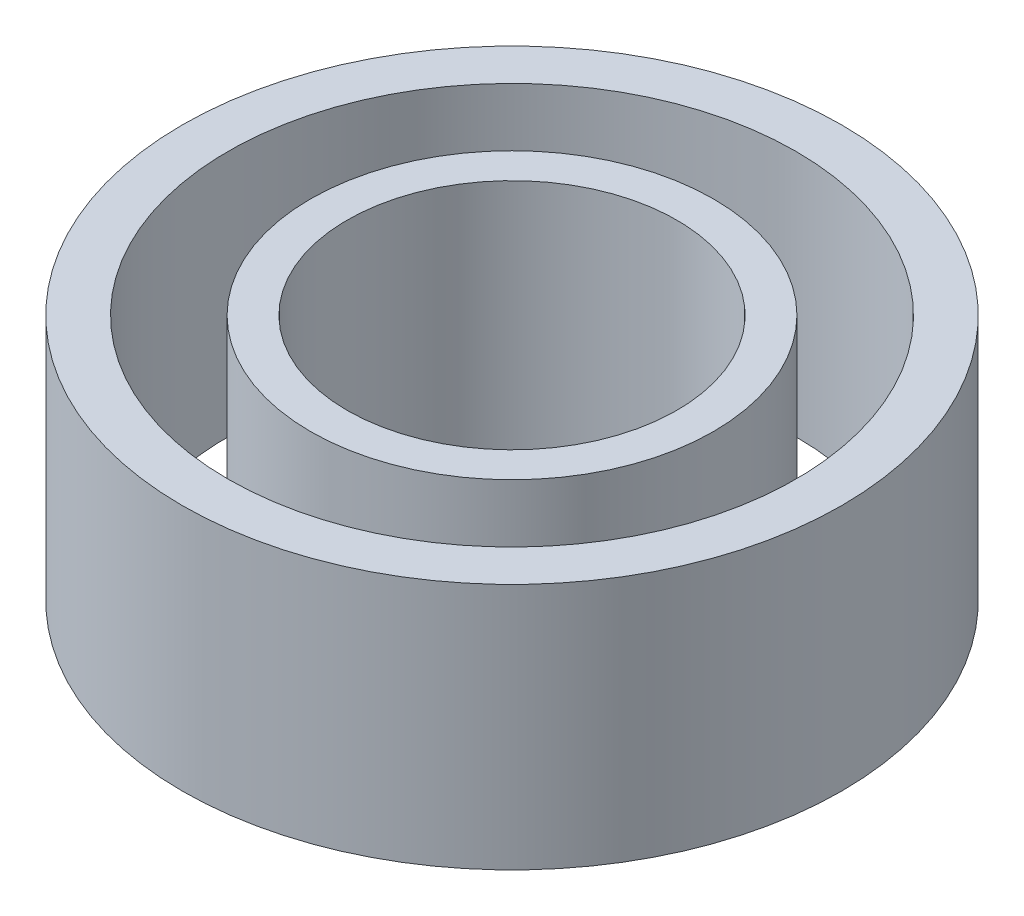
ISO-10303-21;
HEADER;
FILE_DESCRIPTION(('STEP AP214'),'2;1');
FILE_NAME('part.step','',(''),(''),'','','');
FILE_SCHEMA(('AUTOMOTIVE_DESIGN { 1 0 10303 214 1 1 1 1 }'));
ENDSEC;
DATA;
#1=APPLICATION_CONTEXT('core data for automotive mechanical design processes');
#2=APPLICATION_PROTOCOL_DEFINITION('international standard','automotive_design',2000,#1);
#3=PRODUCT_CONTEXT('',#1,'mechanical');
#4=PRODUCT('Part','Part','',(#3));
#5=PRODUCT_RELATED_PRODUCT_CATEGORY('part','',(#4));
#6=PRODUCT_DEFINITION_FORMATION('','',#4);
#7=PRODUCT_DEFINITION_CONTEXT('part definition',#1,'design');
#8=PRODUCT_DEFINITION('design','',#6,#7);
#9=PRODUCT_DEFINITION_SHAPE('','',#8);
#10=(LENGTH_UNIT() NAMED_UNIT(*) SI_UNIT(.MILLI.,.METRE.));
#11=(NAMED_UNIT(*) PLANE_ANGLE_UNIT() SI_UNIT($,.RADIAN.));
#12=(NAMED_UNIT(*) SI_UNIT($,.STERADIAN.) SOLID_ANGLE_UNIT());
#13=UNCERTAINTY_MEASURE_WITH_UNIT(LENGTH_MEASURE(1.E-05),#10,'distance_accuracy_value','');
#14=(GEOMETRIC_REPRESENTATION_CONTEXT(3) GLOBAL_UNCERTAINTY_ASSIGNED_CONTEXT((#13)) GLOBAL_UNIT_ASSIGNED_CONTEXT((#10,
#11,#12)) REPRESENTATION_CONTEXT('',''));
#15=CARTESIAN_POINT('',(0.,0.,0.));
#16=DIRECTION('',(0.,0.,1.));
#17=DIRECTION('',(1.,0.,0.));
#18=AXIS2_PLACEMENT_3D('',#15,#16,#17);
#19=CARTESIAN_POINT('',(0.,3.,0.));
#20=DIRECTION('',(0.,-1.,0.));
#21=DIRECTION('',(0.,0.,-1.));
#22=AXIS2_PLACEMENT_3D('',#19,#20,#21);
#23=CYLINDRICAL_SURFACE('',#22,4.);
#24=CARTESIAN_POINT('',(0.,3.,0.));
#25=DIRECTION('',(0.,1.,0.));
#26=DIRECTION('',(0.,0.,1.));
#27=AXIS2_PLACEMENT_3D('',#24,#25,#26);
#28=CIRCLE('',#27,4.);
#29=CARTESIAN_POINT('',(0.,3.,4.));
#30=VERTEX_POINT('',#29);
#31=EDGE_CURVE('E51',#30,#30,#28,.T.);
#32=ORIENTED_EDGE('',*,*,#31,.F.);
#33=EDGE_LOOP('',(#32));
#34=FACE_BOUND('',#33,.T.);
#35=CARTESIAN_POINT('',(0.,0.,0.));
#36=DIRECTION('',(0.,1.,0.));
#37=DIRECTION('',(0.,0.,1.));
#38=AXIS2_PLACEMENT_3D('',#35,#36,#37);
#39=CIRCLE('',#38,4.);
#40=CARTESIAN_POINT('',(0.,0.,4.));
#41=VERTEX_POINT('',#40);
#42=EDGE_CURVE('E55',#41,#41,#39,.T.);
#43=ORIENTED_EDGE('',*,*,#42,.T.);
#44=EDGE_LOOP('',(#43));
#45=FACE_BOUND('',#44,.T.);
#46=ADVANCED_FACE('F40',(#34,#45),#23,.T.);
#47=CARTESIAN_POINT('',(0.,3.,0.));
#48=DIRECTION('',(0.,1.,0.));
#49=DIRECTION('',(0.,0.,1.));
#50=AXIS2_PLACEMENT_3D('',#47,#48,#49);
#51=PLANE('',#50);
#52=CARTESIAN_POINT('',(0.,3.,0.));
#53=DIRECTION('',(0.,1.,0.));
#54=DIRECTION('',(0.,0.,1.));
#55=AXIS2_PLACEMENT_3D('',#52,#53,#54);
#56=CIRCLE('',#55,3.44443065976869);
#57=CARTESIAN_POINT('',(0.,3.,3.44443065976869));
#58=VERTEX_POINT('',#57);
#59=EDGE_CURVE('E11',#58,#58,#56,.T.);
#60=ORIENTED_EDGE('',*,*,#59,.F.);
#61=EDGE_LOOP('',(#60));
#62=FACE_BOUND('',#61,.T.);
#63=ORIENTED_EDGE('',*,*,#31,.T.);
#64=EDGE_LOOP('',(#63));
#65=FACE_BOUND('',#64,.T.);
#66=ADVANCED_FACE('F62',(#62,#65),#51,.T.);
#67=CARTESIAN_POINT('',(0.,0.,0.));
#68=DIRECTION('',(0.,1.,0.));
#69=DIRECTION('',(0.,0.,1.));
#70=AXIS2_PLACEMENT_3D('',#67,#68,#69);
#71=PLANE('',#70);
#72=CARTESIAN_POINT('',(0.,0.,0.));
#73=DIRECTION('',(0.,1.,0.));
#74=DIRECTION('',(0.,0.,1.));
#75=AXIS2_PLACEMENT_3D('',#72,#73,#74);
#76=CIRCLE('',#75,3.44443065976869);
#77=CARTESIAN_POINT('',(0.,0.,3.44443065976869));
#78=VERTEX_POINT('',#77);
#79=EDGE_CURVE('E44',#78,#78,#76,.T.);
#80=ORIENTED_EDGE('',*,*,#79,.T.);
#81=EDGE_LOOP('',(#80));
#82=FACE_BOUND('',#81,.T.);
#83=ORIENTED_EDGE('',*,*,#42,.F.);
#84=EDGE_LOOP('',(#83));
#85=FACE_BOUND('',#84,.T.);
#86=ADVANCED_FACE('F42',(#82,#85),#71,.F.);
#87=CARTESIAN_POINT('',(0.,0.,0.));
#88=DIRECTION('',(0.,1.,0.));
#89=DIRECTION('',(0.,0.,1.));
#90=AXIS2_PLACEMENT_3D('',#87,#88,#89);
#91=CYLINDRICAL_SURFACE('',#90,3.44443065976869);
#92=ORIENTED_EDGE('',*,*,#79,.F.);
#93=EDGE_LOOP('',(#92));
#94=FACE_BOUND('',#93,.T.);
#95=ORIENTED_EDGE('',*,*,#59,.T.);
#96=EDGE_LOOP('',(#95));
#97=FACE_BOUND('',#96,.T.);
#98=ADVANCED_FACE('F61',(#94,#97),#91,.F.);
#99=CLOSED_SHELL('',(#46,#66,#86,#98));
#100=MANIFOLD_SOLID_BREP('B2',#99);
#101=CARTESIAN_POINT('',(0.,3.,0.));
#102=DIRECTION('',(0.,1.,0.));
#103=DIRECTION('',(0.,0.,1.));
#104=AXIS2_PLACEMENT_3D('',#101,#102,#103);
#105=PLANE('',#104);
#106=CARTESIAN_POINT('',(0.,3.,0.));
#107=DIRECTION('',(0.,1.,0.));
#108=DIRECTION('',(0.,0.,1.));
#109=AXIS2_PLACEMENT_3D('',#106,#107,#108);
#110=CIRCLE('',#109,2.);
#111=CARTESIAN_POINT('',(0.,3.,2.));
#112=VERTEX_POINT('',#111);
#113=EDGE_CURVE('E105',#112,#112,#110,.T.);
#114=ORIENTED_EDGE('',*,*,#113,.F.);
#115=EDGE_LOOP('',(#114));
#116=FACE_BOUND('',#115,.T.);
#117=CARTESIAN_POINT('',(0.,3.,0.));
#118=DIRECTION('',(0.,1.,0.));
#119=DIRECTION('',(0.,0.,1.));
#120=AXIS2_PLACEMENT_3D('',#117,#118,#119);
#121=CIRCLE('',#120,2.44443065976869);
#122=CARTESIAN_POINT('',(0.,3.,2.44443065976869));
#123=VERTEX_POINT('',#122);
#124=EDGE_CURVE('E114',#123,#123,#121,.T.);
#125=ORIENTED_EDGE('',*,*,#124,.T.);
#126=EDGE_LOOP('',(#125));
#127=FACE_BOUND('',#126,.T.);
#128=ADVANCED_FACE('F101',(#116,#127),#105,.T.);
#129=CARTESIAN_POINT('',(0.,0.,0.));
#130=DIRECTION('',(0.,1.,0.));
#131=DIRECTION('',(0.,0.,1.));
#132=AXIS2_PLACEMENT_3D('',#129,#130,#131);
#133=CYLINDRICAL_SURFACE('',#132,2.);
#134=CARTESIAN_POINT('',(0.,0.,0.));
#135=DIRECTION('',(0.,1.,0.));
#136=DIRECTION('',(0.,0.,1.));
#137=AXIS2_PLACEMENT_3D('',#134,#135,#136);
#138=CIRCLE('',#137,2.);
#139=CARTESIAN_POINT('',(0.,0.,2.));
#140=VERTEX_POINT('',#139);
#141=EDGE_CURVE('E39',#140,#140,#138,.T.);
#142=ORIENTED_EDGE('',*,*,#141,.F.);
#143=EDGE_LOOP('',(#142));
#144=FACE_BOUND('',#143,.T.);
#145=ORIENTED_EDGE('',*,*,#113,.T.);
#146=EDGE_LOOP('',(#145));
#147=FACE_BOUND('',#146,.T.);
#148=ADVANCED_FACE('F124',(#144,#147),#133,.F.);
#149=CARTESIAN_POINT('',(0.,0.,0.));
#150=DIRECTION('',(0.,1.,0.));
#151=DIRECTION('',(0.,0.,1.));
#152=AXIS2_PLACEMENT_3D('',#149,#150,#151);
#153=PLANE('',#152);
#154=ORIENTED_EDGE('',*,*,#141,.T.);
#155=EDGE_LOOP('',(#154));
#156=FACE_BOUND('',#155,.T.);
#157=CARTESIAN_POINT('',(0.,0.,0.));
#158=DIRECTION('',(0.,1.,0.));
#159=DIRECTION('',(0.,0.,1.));
#160=AXIS2_PLACEMENT_3D('',#157,#158,#159);
#161=CIRCLE('',#160,2.44443065976869);
#162=CARTESIAN_POINT('',(0.,0.,2.44443065976869));
#163=VERTEX_POINT('',#162);
#164=EDGE_CURVE('E112',#163,#163,#161,.T.);
#165=ORIENTED_EDGE('',*,*,#164,.F.);
#166=EDGE_LOOP('',(#165));
#167=FACE_BOUND('',#166,.T.);
#168=ADVANCED_FACE('F103',(#156,#167),#153,.F.);
#169=CARTESIAN_POINT('',(0.,0.,0.));
#170=DIRECTION('',(0.,1.,0.));
#171=DIRECTION('',(0.,0.,1.));
#172=AXIS2_PLACEMENT_3D('',#169,#170,#171);
#173=CYLINDRICAL_SURFACE('',#172,2.44443065976869);
#174=ORIENTED_EDGE('',*,*,#164,.T.);
#175=EDGE_LOOP('',(#174));
#176=FACE_BOUND('',#175,.T.);
#177=ORIENTED_EDGE('',*,*,#124,.F.);
#178=EDGE_LOOP('',(#177));
#179=FACE_BOUND('',#178,.T.);
#180=ADVANCED_FACE('F120',(#176,#179),#173,.T.);
#181=CLOSED_SHELL('',(#128,#148,#168,#180));
#182=MANIFOLD_SOLID_BREP('B6',#181);
#183=ADVANCED_BREP_SHAPE_REPRESENTATION('',(#18,#100,#182),#14);
#184=SHAPE_DEFINITION_REPRESENTATION(#9,#183);
ENDSEC;
END-ISO-10303-21;
